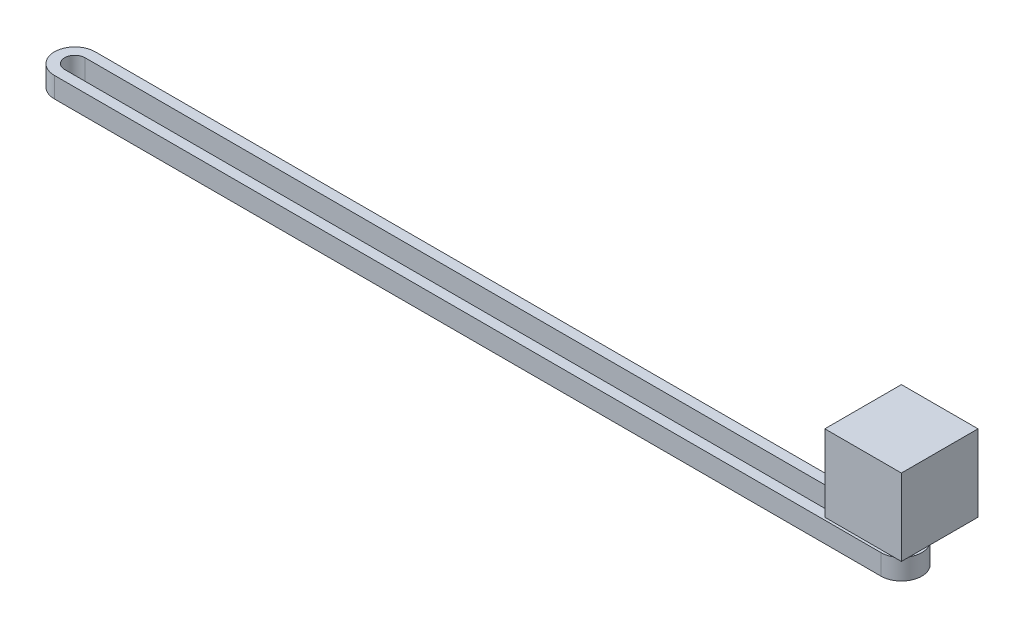
ISO-10303-21;
HEADER;
FILE_DESCRIPTION(('STEP AP214'),'2;1');
FILE_NAME('part.step','',(''),(''),'','','');
FILE_SCHEMA(('AUTOMOTIVE_DESIGN { 1 0 10303 214 1 1 1 1 }'));
ENDSEC;
DATA;
#1=APPLICATION_CONTEXT('core data for automotive mechanical design processes');
#2=APPLICATION_PROTOCOL_DEFINITION('international standard','automotive_design',2000,#1);
#3=PRODUCT_CONTEXT('',#1,'mechanical');
#4=PRODUCT('Part','Part','',(#3));
#5=PRODUCT_RELATED_PRODUCT_CATEGORY('part','',(#4));
#6=PRODUCT_DEFINITION_FORMATION('','',#4);
#7=PRODUCT_DEFINITION_CONTEXT('part definition',#1,'design');
#8=PRODUCT_DEFINITION('design','',#6,#7);
#9=PRODUCT_DEFINITION_SHAPE('','',#8);
#10=(LENGTH_UNIT() NAMED_UNIT(*) SI_UNIT(.MILLI.,.METRE.));
#11=(NAMED_UNIT(*) PLANE_ANGLE_UNIT() SI_UNIT($,.RADIAN.));
#12=(NAMED_UNIT(*) SI_UNIT($,.STERADIAN.) SOLID_ANGLE_UNIT());
#13=UNCERTAINTY_MEASURE_WITH_UNIT(LENGTH_MEASURE(1.E-05),#10,'distance_accuracy_value','');
#14=(GEOMETRIC_REPRESENTATION_CONTEXT(3) GLOBAL_UNCERTAINTY_ASSIGNED_CONTEXT((#13)) GLOBAL_UNIT_ASSIGNED_CONTEXT((#10,
#11,#12)) REPRESENTATION_CONTEXT('',''));
#15=CARTESIAN_POINT('',(0.,0.,0.));
#16=DIRECTION('',(0.,0.,1.));
#17=DIRECTION('',(1.,0.,0.));
#18=AXIS2_PLACEMENT_3D('',#15,#16,#17);
#19=CARTESIAN_POINT('',(0.,-2.,0.));
#20=DIRECTION('',(0.,-1.,0.));
#21=DIRECTION('',(0.,0.,-1.));
#22=AXIS2_PLACEMENT_3D('',#19,#20,#21);
#23=PLANE('',#22);
#24=CARTESIAN_POINT('',(230.,-2.,2.00000000000004));
#25=DIRECTION('',(0.,-1.,0.));
#26=DIRECTION('',(0.,0.,-1.));
#27=AXIS2_PLACEMENT_3D('',#24,#25,#26);
#28=CIRCLE('',#27,2.);
#29=CARTESIAN_POINT('',(230.,-2.,4.00000000000001));
#30=VERTEX_POINT('',#29);
#31=CARTESIAN_POINT('',(230.,-2.,0.));
#32=VERTEX_POINT('',#31);
#33=EDGE_CURVE('E11',#30,#32,#28,.F.);
#34=ORIENTED_EDGE('',*,*,#33,.F.);
#35=DIRECTION('',(-1.,0.,0.));
#36=VECTOR('',#35,1.);
#37=CARTESIAN_POINT('',(232.,-2.,4.00000000000001));
#38=LINE('',#37,#36);
#39=CARTESIAN_POINT('',(228.,-2.,4.00000000000002));
#40=VERTEX_POINT('',#39);
#41=EDGE_CURVE('E249',#30,#40,#38,.T.);
#42=ORIENTED_EDGE('',*,*,#41,.T.);
#43=DIRECTION('',(0.,0.,-1.));
#44=VECTOR('',#43,1.);
#45=CARTESIAN_POINT('',(228.,-2.,4.00000000000002));
#46=LINE('',#45,#44);
#47=CARTESIAN_POINT('',(228.,-2.,0.));
#48=VERTEX_POINT('',#47);
#49=EDGE_CURVE('E246',#40,#48,#46,.T.);
#50=ORIENTED_EDGE('',*,*,#49,.T.);
#51=DIRECTION('',(-1.,0.,0.));
#52=VECTOR('',#51,1.);
#53=CARTESIAN_POINT('',(232.,-2.,0.));
#54=LINE('',#53,#52);
#55=EDGE_CURVE('E243',#32,#48,#54,.T.);
#56=ORIENTED_EDGE('',*,*,#55,.F.);
#57=EDGE_LOOP('',(#34,#42,#50,#56));
#58=FACE_BOUND('',#57,.T.);
#59=ADVANCED_FACE('F37',(#58),#23,.T.);
#60=CARTESIAN_POINT('',(230.,4.,2.00000000000004));
#61=DIRECTION('',(0.,-1.,0.));
#62=DIRECTION('',(0.,0.,-1.));
#63=AXIS2_PLACEMENT_3D('',#60,#61,#62);
#64=CYLINDRICAL_SURFACE('',#63,2.);
#65=CARTESIAN_POINT('',(230.,4.,2.00000000000004));
#66=DIRECTION('',(0.,1.,0.));
#67=DIRECTION('',(0.,0.,1.));
#68=AXIS2_PLACEMENT_3D('',#65,#66,#67);
#69=CIRCLE('',#68,2.);
#70=CARTESIAN_POINT('',(230.,4.,4.00000000000004));
#71=VERTEX_POINT('',#70);
#72=EDGE_CURVE('E176',#71,#71,#69,.F.);
#73=ORIENTED_EDGE('',*,*,#72,.T.);
#74=EDGE_LOOP('',(#73));
#75=FACE_BOUND('',#74,.T.);
#76=CARTESIAN_POINT('',(230.,0.,2.00000000000004));
#77=DIRECTION('',(0.,1.,0.));
#78=DIRECTION('',(0.,0.,1.));
#79=AXIS2_PLACEMENT_3D('',#76,#77,#78);
#80=CIRCLE('',#79,2.);
#81=CARTESIAN_POINT('',(228.,0.,2.00000000000004));
#82=VERTEX_POINT('',#81);
#83=EDGE_CURVE('E45',#82,#82,#80,.F.);
#84=ORIENTED_EDGE('',*,*,#83,.F.);
#85=EDGE_LOOP('',(#84));
#86=FACE_BOUND('',#85,.T.);
#87=ADVANCED_FACE('F39',(#75,#86),#64,.T.);
#88=CARTESIAN_POINT('',(0.,0.,0.));
#89=DIRECTION('',(0.,-1.,0.));
#90=DIRECTION('',(0.,0.,-1.));
#91=AXIS2_PLACEMENT_3D('',#88,#89,#90);
#92=PLANE('',#91);
#93=DIRECTION('',(-1.,0.,0.));
#94=VECTOR('',#93,1.);
#95=CARTESIAN_POINT('',(0.,0.,0.));
#96=LINE('',#95,#94);
#97=CARTESIAN_POINT('',(228.,0.,0.));
#98=VERTEX_POINT('',#97);
#99=CARTESIAN_POINT('',(68.1169302318838,0.,0.));
#100=VERTEX_POINT('',#99);
#101=EDGE_CURVE('E204',#98,#100,#96,.T.);
#102=ORIENTED_EDGE('',*,*,#101,.F.);
#103=DIRECTION('',(0.,0.,-1.));
#104=VECTOR('',#103,1.);
#105=CARTESIAN_POINT('',(228.,0.,4.00000000000002));
#106=LINE('',#105,#104);
#107=EDGE_CURVE('E225',#82,#98,#106,.T.);
#108=ORIENTED_EDGE('',*,*,#107,.F.);
#109=ORIENTED_EDGE('',*,*,#83,.T.);
#110=CARTESIAN_POINT('',(228.,0.,4.00000000000002));
#111=VERTEX_POINT('',#110);
#112=EDGE_CURVE('E247',#111,#82,#106,.T.);
#113=ORIENTED_EDGE('',*,*,#112,.F.);
#114=DIRECTION('',(-1.,0.,0.));
#115=VECTOR('',#114,1.);
#116=CARTESIAN_POINT('',(0.,0.,4.00000000000004));
#117=LINE('',#116,#115);
#118=CARTESIAN_POINT('',(68.1169302318838,0.,4.00000000000004));
#119=VERTEX_POINT('',#118);
#120=EDGE_CURVE('E206',#111,#119,#117,.T.);
#121=ORIENTED_EDGE('',*,*,#120,.T.);
#122=CARTESIAN_POINT('',(68.1169302318838,0.,2.00000000000004));
#123=DIRECTION('',(0.,1.,0.));
#124=DIRECTION('',(0.,0.,1.));
#125=AXIS2_PLACEMENT_3D('',#122,#123,#124);
#126=CIRCLE('',#125,2.);
#127=EDGE_CURVE('E208',#100,#119,#126,.T.);
#128=ORIENTED_EDGE('',*,*,#127,.F.);
#129=EDGE_LOOP('',(#102,#108,#109,#113,#121,#128));
#130=FACE_BOUND('',#129,.T.);
#131=CARTESIAN_POINT('',(230.,0.,2.00000000000004));
#132=DIRECTION('',(0.,1.,0.));
#133=DIRECTION('',(0.,0.,1.));
#134=AXIS2_PLACEMENT_3D('',#131,#132,#133);
#135=CIRCLE('',#134,4.);
#136=CARTESIAN_POINT('',(230.,0.,-1.99999999999996));
#137=VERTEX_POINT('',#136);
#138=CARTESIAN_POINT('',(230.,0.,6.00000000000004));
#139=VERTEX_POINT('',#138);
#140=EDGE_CURVE('E211',#137,#139,#135,.F.);
#141=ORIENTED_EDGE('',*,*,#140,.F.);
#142=DIRECTION('',(-1.,0.,0.));
#143=VECTOR('',#142,1.);
#144=CARTESIAN_POINT('',(0.,0.,-1.99999999999996));
#145=LINE('',#144,#143);
#146=CARTESIAN_POINT('',(68.1169302318838,0.,-1.99999999999996));
#147=VERTEX_POINT('',#146);
#148=EDGE_CURVE('E214',#137,#147,#145,.T.);
#149=ORIENTED_EDGE('',*,*,#148,.T.);
#150=CARTESIAN_POINT('',(68.1169302318838,0.,2.00000000000004));
#151=DIRECTION('',(0.,1.,0.));
#152=DIRECTION('',(0.,0.,1.));
#153=AXIS2_PLACEMENT_3D('',#150,#151,#152);
#154=CIRCLE('',#153,4.);
#155=CARTESIAN_POINT('',(68.1169302318838,0.,6.00000000000004));
#156=VERTEX_POINT('',#155);
#157=EDGE_CURVE('E217',#147,#156,#154,.T.);
#158=ORIENTED_EDGE('',*,*,#157,.T.);
#159=DIRECTION('',(-1.,0.,0.));
#160=VECTOR('',#159,1.);
#161=CARTESIAN_POINT('',(0.,0.,6.00000000000004));
#162=LINE('',#161,#160);
#163=EDGE_CURVE('E184',#139,#156,#162,.T.);
#164=ORIENTED_EDGE('',*,*,#163,.F.);
#165=EDGE_LOOP('',(#141,#149,#158,#164));
#166=FACE_BOUND('',#165,.T.);
#167=ADVANCED_FACE('F263',(#130,#166),#92,.F.);
#168=CARTESIAN_POINT('',(228.,-2.,4.00000000000002));
#169=DIRECTION('',(1.,0.,0.));
#170=DIRECTION('',(0.,0.,-1.));
#171=AXIS2_PLACEMENT_3D('',#168,#169,#170);
#172=PLANE('',#171);
#173=ORIENTED_EDGE('',*,*,#112,.T.);
#174=ORIENTED_EDGE('',*,*,#107,.T.);
#175=DIRECTION('',(0.,1.,0.));
#176=VECTOR('',#175,1.);
#177=CARTESIAN_POINT('',(228.,-2.,0.));
#178=LINE('',#177,#176);
#179=EDGE_CURVE('E251',#48,#98,#178,.T.);
#180=ORIENTED_EDGE('',*,*,#179,.F.);
#181=ORIENTED_EDGE('',*,*,#49,.F.);
#182=DIRECTION('',(0.,1.,0.));
#183=VECTOR('',#182,1.);
#184=CARTESIAN_POINT('',(228.,-2.,4.00000000000002));
#185=LINE('',#184,#183);
#186=EDGE_CURVE('E254',#40,#111,#185,.T.);
#187=ORIENTED_EDGE('',*,*,#186,.T.);
#188=EDGE_LOOP('',(#173,#174,#180,#181,#187));
#189=FACE_BOUND('',#188,.T.);
#190=ADVANCED_FACE('F269',(#189),#172,.F.);
#191=CARTESIAN_POINT('',(0.,-4.,0.));
#192=DIRECTION('',(0.,0.,-1.));
#193=DIRECTION('',(-1.,0.,0.));
#194=AXIS2_PLACEMENT_3D('',#191,#192,#193);
#195=PLANE('',#194);
#196=ORIENTED_EDGE('',*,*,#55,.T.);
#197=ORIENTED_EDGE('',*,*,#179,.T.);
#198=ORIENTED_EDGE('',*,*,#101,.T.);
#199=DIRECTION('',(0.,1.,0.));
#200=VECTOR('',#199,1.);
#201=CARTESIAN_POINT('',(68.1169302318838,-4.,0.));
#202=LINE('',#201,#200);
#203=CARTESIAN_POINT('',(68.1169302318838,-4.,0.));
#204=VERTEX_POINT('',#203);
#205=EDGE_CURVE('E232',#204,#100,#202,.T.);
#206=ORIENTED_EDGE('',*,*,#205,.F.);
#207=DIRECTION('',(-1.,0.,0.));
#208=VECTOR('',#207,1.);
#209=CARTESIAN_POINT('',(0.,-4.,0.));
#210=LINE('',#209,#208);
#211=CARTESIAN_POINT('',(230.,-4.,0.));
#212=VERTEX_POINT('',#211);
#213=EDGE_CURVE('E180',#212,#204,#210,.T.);
#214=ORIENTED_EDGE('',*,*,#213,.F.);
#215=DIRECTION('',(0.,1.,0.));
#216=VECTOR('',#215,1.);
#217=CARTESIAN_POINT('',(230.,-4.,0.));
#218=LINE('',#217,#216);
#219=EDGE_CURVE('E203',#212,#32,#218,.T.);
#220=ORIENTED_EDGE('',*,*,#219,.T.);
#221=EDGE_LOOP('',(#196,#197,#198,#206,#214,#220));
#222=FACE_BOUND('',#221,.T.);
#223=ADVANCED_FACE('F280',(#222),#195,.F.);
#224=CARTESIAN_POINT('',(0.,-4.,4.00000000000004));
#225=DIRECTION('',(0.,0.,-1.));
#226=DIRECTION('',(-1.,0.,0.));
#227=AXIS2_PLACEMENT_3D('',#224,#225,#226);
#228=PLANE('',#227);
#229=ORIENTED_EDGE('',*,*,#186,.F.);
#230=ORIENTED_EDGE('',*,*,#41,.F.);
#231=DIRECTION('',(0.,1.,0.));
#232=VECTOR('',#231,1.);
#233=CARTESIAN_POINT('',(230.,-4.,4.00000000000003));
#234=LINE('',#233,#232);
#235=CARTESIAN_POINT('',(230.,-4.,4.00000000000003));
#236=VERTEX_POINT('',#235);
#237=EDGE_CURVE('E238',#236,#30,#234,.T.);
#238=ORIENTED_EDGE('',*,*,#237,.F.);
#239=DIRECTION('',(-1.,0.,0.));
#240=VECTOR('',#239,1.);
#241=CARTESIAN_POINT('',(0.,-4.,4.00000000000004));
#242=LINE('',#241,#240);
#243=CARTESIAN_POINT('',(68.1169302318838,-4.,4.00000000000004));
#244=VERTEX_POINT('',#243);
#245=EDGE_CURVE('E187',#236,#244,#242,.T.);
#246=ORIENTED_EDGE('',*,*,#245,.T.);
#247=DIRECTION('',(0.,1.,0.));
#248=VECTOR('',#247,1.);
#249=CARTESIAN_POINT('',(68.1169302318838,-4.,4.00000000000004));
#250=LINE('',#249,#248);
#251=EDGE_CURVE('E235',#244,#119,#250,.T.);
#252=ORIENTED_EDGE('',*,*,#251,.T.);
#253=ORIENTED_EDGE('',*,*,#120,.F.);
#254=EDGE_LOOP('',(#229,#230,#238,#246,#252,#253));
#255=FACE_BOUND('',#254,.T.);
#256=ADVANCED_FACE('F273',(#255),#228,.T.);
#257=CARTESIAN_POINT('',(230.,-4.,2.00000000000004));
#258=DIRECTION('',(0.,1.,0.));
#259=DIRECTION('',(0.,0.,1.));
#260=AXIS2_PLACEMENT_3D('',#257,#258,#259);
#261=CYLINDRICAL_SURFACE('',#260,4.);
#262=ORIENTED_EDGE('',*,*,#140,.T.);
#263=DIRECTION('',(0.,1.,0.));
#264=VECTOR('',#263,1.);
#265=CARTESIAN_POINT('',(230.,-4.,6.00000000000004));
#266=LINE('',#265,#264);
#267=CARTESIAN_POINT('',(230.,-4.,6.00000000000004));
#268=VERTEX_POINT('',#267);
#269=EDGE_CURVE('E222',#268,#139,#266,.T.);
#270=ORIENTED_EDGE('',*,*,#269,.F.);
#271=CARTESIAN_POINT('',(230.,-4.,2.00000000000004));
#272=DIRECTION('',(0.,1.,0.));
#273=DIRECTION('',(0.,0.,1.));
#274=AXIS2_PLACEMENT_3D('',#271,#272,#273);
#275=CIRCLE('',#274,4.);
#276=CARTESIAN_POINT('',(230.,-4.,-1.99999999999996));
#277=VERTEX_POINT('',#276);
#278=EDGE_CURVE('E192',#277,#268,#275,.F.);
#279=ORIENTED_EDGE('',*,*,#278,.F.);
#280=DIRECTION('',(0.,1.,0.));
#281=VECTOR('',#280,1.);
#282=CARTESIAN_POINT('',(230.,-4.,-1.99999999999996));
#283=LINE('',#282,#281);
#284=EDGE_CURVE('E230',#277,#137,#283,.T.);
#285=ORIENTED_EDGE('',*,*,#284,.T.);
#286=EDGE_LOOP('',(#262,#270,#279,#285));
#287=FACE_BOUND('',#286,.T.);
#288=ADVANCED_FACE('F297',(#287),#261,.T.);
#289=CARTESIAN_POINT('',(0.,-4.,6.00000000000004));
#290=DIRECTION('',(0.,0.,-1.));
#291=DIRECTION('',(-1.,0.,0.));
#292=AXIS2_PLACEMENT_3D('',#289,#290,#291);
#293=PLANE('',#292);
#294=ORIENTED_EDGE('',*,*,#163,.T.);
#295=DIRECTION('',(0.,1.,0.));
#296=VECTOR('',#295,1.);
#297=CARTESIAN_POINT('',(68.1169302318838,-4.,6.00000000000004));
#298=LINE('',#297,#296);
#299=CARTESIAN_POINT('',(68.1169302318838,-4.,6.00000000000004));
#300=VERTEX_POINT('',#299);
#301=EDGE_CURVE('E226',#300,#156,#298,.T.);
#302=ORIENTED_EDGE('',*,*,#301,.F.);
#303=DIRECTION('',(-1.,0.,0.));
#304=VECTOR('',#303,1.);
#305=CARTESIAN_POINT('',(0.,-4.,6.00000000000004));
#306=LINE('',#305,#304);
#307=EDGE_CURVE('E201',#268,#300,#306,.T.);
#308=ORIENTED_EDGE('',*,*,#307,.F.);
#309=ORIENTED_EDGE('',*,*,#269,.T.);
#310=EDGE_LOOP('',(#294,#302,#308,#309));
#311=FACE_BOUND('',#310,.T.);
#312=ADVANCED_FACE('F300',(#311),#293,.F.);
#313=CARTESIAN_POINT('',(68.1169302318838,-4.,2.00000000000004));
#314=DIRECTION('',(0.,1.,0.));
#315=DIRECTION('',(0.,0.,1.));
#316=AXIS2_PLACEMENT_3D('',#313,#314,#315);
#317=CYLINDRICAL_SURFACE('',#316,4.);
#318=ORIENTED_EDGE('',*,*,#157,.F.);
#319=DIRECTION('',(0.,1.,0.));
#320=VECTOR('',#319,1.);
#321=CARTESIAN_POINT('',(68.1169302318838,-4.,-1.99999999999996));
#322=LINE('',#321,#320);
#323=CARTESIAN_POINT('',(68.1169302318838,-4.,-1.99999999999996));
#324=VERTEX_POINT('',#323);
#325=EDGE_CURVE('E228',#324,#147,#322,.T.);
#326=ORIENTED_EDGE('',*,*,#325,.F.);
#327=CARTESIAN_POINT('',(68.1169302318838,-4.,2.00000000000004));
#328=DIRECTION('',(0.,1.,0.));
#329=DIRECTION('',(0.,0.,1.));
#330=AXIS2_PLACEMENT_3D('',#327,#328,#329);
#331=CIRCLE('',#330,4.);
#332=EDGE_CURVE('E198',#324,#300,#331,.T.);
#333=ORIENTED_EDGE('',*,*,#332,.T.);
#334=ORIENTED_EDGE('',*,*,#301,.T.);
#335=EDGE_LOOP('',(#318,#326,#333,#334));
#336=FACE_BOUND('',#335,.T.);
#337=ADVANCED_FACE('F303',(#336),#317,.T.);
#338=CARTESIAN_POINT('',(68.1169302318838,-4.,2.00000000000004));
#339=DIRECTION('',(0.,1.,0.));
#340=DIRECTION('',(0.,0.,1.));
#341=AXIS2_PLACEMENT_3D('',#338,#339,#340);
#342=CYLINDRICAL_SURFACE('',#341,2.);
#343=ORIENTED_EDGE('',*,*,#127,.T.);
#344=ORIENTED_EDGE('',*,*,#251,.F.);
#345=CARTESIAN_POINT('',(68.1169302318838,-4.,2.00000000000004));
#346=DIRECTION('',(0.,1.,0.));
#347=DIRECTION('',(0.,0.,1.));
#348=AXIS2_PLACEMENT_3D('',#345,#346,#347);
#349=CIRCLE('',#348,2.);
#350=EDGE_CURVE('E190',#204,#244,#349,.T.);
#351=ORIENTED_EDGE('',*,*,#350,.F.);
#352=ORIENTED_EDGE('',*,*,#205,.T.);
#353=EDGE_LOOP('',(#343,#344,#351,#352));
#354=FACE_BOUND('',#353,.T.);
#355=ADVANCED_FACE('F277',(#354),#342,.F.);
#356=CARTESIAN_POINT('',(230.,-4.,2.00000000000004));
#357=DIRECTION('',(0.,1.,0.));
#358=DIRECTION('',(0.,0.,1.));
#359=AXIS2_PLACEMENT_3D('',#356,#357,#358);
#360=CYLINDRICAL_SURFACE('',#359,2.);
#361=ORIENTED_EDGE('',*,*,#237,.T.);
#362=ORIENTED_EDGE('',*,*,#33,.T.);
#363=ORIENTED_EDGE('',*,*,#219,.F.);
#364=CARTESIAN_POINT('',(230.,-4.,2.00000000000004));
#365=DIRECTION('',(0.,1.,0.));
#366=DIRECTION('',(0.,0.,1.));
#367=AXIS2_PLACEMENT_3D('',#364,#365,#366);
#368=CIRCLE('',#367,2.);
#369=EDGE_CURVE('E183',#212,#236,#368,.F.);
#370=ORIENTED_EDGE('',*,*,#369,.T.);
#371=EDGE_LOOP('',(#361,#362,#363,#370));
#372=FACE_BOUND('',#371,.T.);
#373=ADVANCED_FACE('F283',(#372),#360,.F.);
#374=CARTESIAN_POINT('',(0.,-4.,-1.99999999999996));
#375=DIRECTION('',(0.,0.,-1.));
#376=DIRECTION('',(-1.,0.,0.));
#377=AXIS2_PLACEMENT_3D('',#374,#375,#376);
#378=PLANE('',#377);
#379=ORIENTED_EDGE('',*,*,#148,.F.);
#380=ORIENTED_EDGE('',*,*,#284,.F.);
#381=DIRECTION('',(-1.,0.,0.));
#382=VECTOR('',#381,1.);
#383=CARTESIAN_POINT('',(0.,-4.,-1.99999999999996));
#384=LINE('',#383,#382);
#385=EDGE_CURVE('E195',#277,#324,#384,.T.);
#386=ORIENTED_EDGE('',*,*,#385,.T.);
#387=ORIENTED_EDGE('',*,*,#325,.T.);
#388=EDGE_LOOP('',(#379,#380,#386,#387));
#389=FACE_BOUND('',#388,.T.);
#390=ADVANCED_FACE('F289',(#389),#378,.T.);
#391=CARTESIAN_POINT('',(0.,-4.,0.));
#392=DIRECTION('',(0.,1.,0.));
#393=DIRECTION('',(0.,0.,1.));
#394=AXIS2_PLACEMENT_3D('',#391,#392,#393);
#395=PLANE('',#394);
#396=ORIENTED_EDGE('',*,*,#213,.T.);
#397=ORIENTED_EDGE('',*,*,#350,.T.);
#398=ORIENTED_EDGE('',*,*,#245,.F.);
#399=ORIENTED_EDGE('',*,*,#369,.F.);
#400=EDGE_LOOP('',(#396,#397,#398,#399));
#401=FACE_BOUND('',#400,.T.);
#402=ORIENTED_EDGE('',*,*,#278,.T.);
#403=ORIENTED_EDGE('',*,*,#307,.T.);
#404=ORIENTED_EDGE('',*,*,#332,.F.);
#405=ORIENTED_EDGE('',*,*,#385,.F.);
#406=EDGE_LOOP('',(#402,#403,#404,#405));
#407=FACE_BOUND('',#406,.T.);
#408=ADVANCED_FACE('F286',(#401,#407),#395,.F.);
#409=CARTESIAN_POINT('',(0.,19.,9.50000000000005));
#410=DIRECTION('',(0.,0.,1.));
#411=DIRECTION('',(1.,0.,0.));
#412=AXIS2_PLACEMENT_3D('',#409,#410,#411);
#413=PLANE('',#412);
#414=DIRECTION('',(-1.,0.,0.));
#415=VECTOR('',#414,1.);
#416=CARTESIAN_POINT('',(0.,4.,9.50000000000005));
#417=LINE('',#416,#415);
#418=CARTESIAN_POINT('',(237.5,4.,9.50000000000005));
#419=VERTEX_POINT('',#418);
#420=CARTESIAN_POINT('',(222.5,4.,9.50000000000005));
#421=VERTEX_POINT('',#420);
#422=EDGE_CURVE('E171',#419,#421,#417,.T.);
#423=ORIENTED_EDGE('',*,*,#422,.F.);
#424=DIRECTION('',(0.,-1.,0.));
#425=VECTOR('',#424,1.);
#426=CARTESIAN_POINT('',(237.5,19.,9.50000000000005));
#427=LINE('',#426,#425);
#428=CARTESIAN_POINT('',(237.5,19.,9.50000000000005));
#429=VERTEX_POINT('',#428);
#430=EDGE_CURVE('E162',#429,#419,#427,.T.);
#431=ORIENTED_EDGE('',*,*,#430,.F.);
#432=DIRECTION('',(-1.,0.,0.));
#433=VECTOR('',#432,1.);
#434=CARTESIAN_POINT('',(0.,19.,9.50000000000005));
#435=LINE('',#434,#433);
#436=CARTESIAN_POINT('',(222.5,19.,9.50000000000005));
#437=VERTEX_POINT('',#436);
#438=EDGE_CURVE('E142',#429,#437,#435,.T.);
#439=ORIENTED_EDGE('',*,*,#438,.T.);
#440=DIRECTION('',(0.,-1.,0.));
#441=VECTOR('',#440,1.);
#442=CARTESIAN_POINT('',(222.5,19.,9.50000000000005));
#443=LINE('',#442,#441);
#444=EDGE_CURVE('E151',#437,#421,#443,.T.);
#445=ORIENTED_EDGE('',*,*,#444,.T.);
#446=EDGE_LOOP('',(#423,#431,#439,#445));
#447=FACE_BOUND('',#446,.T.);
#448=ADVANCED_FACE('F161',(#447),#413,.T.);
#449=CARTESIAN_POINT('',(237.5,19.,0.));
#450=DIRECTION('',(1.,0.,0.));
#451=DIRECTION('',(0.,0.,-1.));
#452=AXIS2_PLACEMENT_3D('',#449,#450,#451);
#453=PLANE('',#452);
#454=DIRECTION('',(0.,0.,1.));
#455=VECTOR('',#454,1.);
#456=CARTESIAN_POINT('',(237.5,4.,0.));
#457=LINE('',#456,#455);
#458=CARTESIAN_POINT('',(237.5,4.,-5.49999999999997));
#459=VERTEX_POINT('',#458);
#460=EDGE_CURVE('E163',#459,#419,#457,.T.);
#461=ORIENTED_EDGE('',*,*,#460,.F.);
#462=DIRECTION('',(0.,-1.,0.));
#463=VECTOR('',#462,1.);
#464=CARTESIAN_POINT('',(237.5,19.,-5.49999999999997));
#465=LINE('',#464,#463);
#466=CARTESIAN_POINT('',(237.5,19.,-5.49999999999997));
#467=VERTEX_POINT('',#466);
#468=EDGE_CURVE('E177',#467,#459,#465,.T.);
#469=ORIENTED_EDGE('',*,*,#468,.F.);
#470=DIRECTION('',(0.,0.,1.));
#471=VECTOR('',#470,1.);
#472=CARTESIAN_POINT('',(237.5,19.,0.));
#473=LINE('',#472,#471);
#474=EDGE_CURVE('E159',#467,#429,#473,.T.);
#475=ORIENTED_EDGE('',*,*,#474,.T.);
#476=ORIENTED_EDGE('',*,*,#430,.T.);
#477=EDGE_LOOP('',(#461,#469,#475,#476));
#478=FACE_BOUND('',#477,.T.);
#479=ADVANCED_FACE('F336',(#478),#453,.T.);
#480=CARTESIAN_POINT('',(0.,19.,-5.49999999999997));
#481=DIRECTION('',(0.,0.,1.));
#482=DIRECTION('',(1.,0.,0.));
#483=AXIS2_PLACEMENT_3D('',#480,#481,#482);
#484=PLANE('',#483);
#485=DIRECTION('',(-1.,0.,0.));
#486=VECTOR('',#485,1.);
#487=CARTESIAN_POINT('',(0.,4.,-5.49999999999997));
#488=LINE('',#487,#486);
#489=CARTESIAN_POINT('',(222.5,4.,-5.49999999999997));
#490=VERTEX_POINT('',#489);
#491=EDGE_CURVE('E166',#459,#490,#488,.T.);
#492=ORIENTED_EDGE('',*,*,#491,.T.);
#493=DIRECTION('',(0.,-1.,0.));
#494=VECTOR('',#493,1.);
#495=CARTESIAN_POINT('',(222.5,19.,-5.49999999999997));
#496=LINE('',#495,#494);
#497=CARTESIAN_POINT('',(222.5,19.,-5.49999999999997));
#498=VERTEX_POINT('',#497);
#499=EDGE_CURVE('E158',#498,#490,#496,.T.);
#500=ORIENTED_EDGE('',*,*,#499,.F.);
#501=DIRECTION('',(-1.,0.,0.));
#502=VECTOR('',#501,1.);
#503=CARTESIAN_POINT('',(0.,19.,-5.49999999999997));
#504=LINE('',#503,#502);
#505=EDGE_CURVE('E145',#467,#498,#504,.T.);
#506=ORIENTED_EDGE('',*,*,#505,.F.);
#507=ORIENTED_EDGE('',*,*,#468,.T.);
#508=EDGE_LOOP('',(#492,#500,#506,#507));
#509=FACE_BOUND('',#508,.T.);
#510=ADVANCED_FACE('F339',(#509),#484,.F.);
#511=CARTESIAN_POINT('',(222.5,19.,0.));
#512=DIRECTION('',(1.,0.,0.));
#513=DIRECTION('',(0.,0.,-1.));
#514=AXIS2_PLACEMENT_3D('',#511,#512,#513);
#515=PLANE('',#514);
#516=DIRECTION('',(0.,0.,1.));
#517=VECTOR('',#516,1.);
#518=CARTESIAN_POINT('',(222.5,4.,0.));
#519=LINE('',#518,#517);
#520=EDGE_CURVE('E154',#490,#421,#519,.T.);
#521=ORIENTED_EDGE('',*,*,#520,.T.);
#522=ORIENTED_EDGE('',*,*,#444,.F.);
#523=DIRECTION('',(0.,0.,1.));
#524=VECTOR('',#523,1.);
#525=CARTESIAN_POINT('',(222.5,19.,0.));
#526=LINE('',#525,#524);
#527=EDGE_CURVE('E137',#498,#437,#526,.T.);
#528=ORIENTED_EDGE('',*,*,#527,.F.);
#529=ORIENTED_EDGE('',*,*,#499,.T.);
#530=EDGE_LOOP('',(#521,#522,#528,#529));
#531=FACE_BOUND('',#530,.T.);
#532=ADVANCED_FACE('F152',(#531),#515,.F.);
#533=CARTESIAN_POINT('',(0.,19.,0.));
#534=DIRECTION('',(0.,1.,0.));
#535=DIRECTION('',(0.,0.,1.));
#536=AXIS2_PLACEMENT_3D('',#533,#534,#535);
#537=PLANE('',#536);
#538=ORIENTED_EDGE('',*,*,#438,.F.);
#539=ORIENTED_EDGE('',*,*,#474,.F.);
#540=ORIENTED_EDGE('',*,*,#505,.T.);
#541=ORIENTED_EDGE('',*,*,#527,.T.);
#542=EDGE_LOOP('',(#538,#539,#540,#541));
#543=FACE_BOUND('',#542,.T.);
#544=ADVANCED_FACE('F139',(#543),#537,.T.);
#545=CARTESIAN_POINT('',(0.,4.,0.));
#546=DIRECTION('',(0.,1.,0.));
#547=DIRECTION('',(0.,0.,1.));
#548=AXIS2_PLACEMENT_3D('',#545,#546,#547);
#549=PLANE('',#548);
#550=ORIENTED_EDGE('',*,*,#72,.F.);
#551=EDGE_LOOP('',(#550));
#552=FACE_BOUND('',#551,.T.);
#553=ORIENTED_EDGE('',*,*,#422,.T.);
#554=ORIENTED_EDGE('',*,*,#520,.F.);
#555=ORIENTED_EDGE('',*,*,#491,.F.);
#556=ORIENTED_EDGE('',*,*,#460,.T.);
#557=EDGE_LOOP('',(#553,#554,#555,#556));
#558=FACE_BOUND('',#557,.T.);
#559=ADVANCED_FACE('F346',(#552,#558),#549,.F.);
#560=CLOSED_SHELL('',(#59,#87,#167,#190,#223,#256,#288,#312,#337,#355,#373,#390,#408,#448,#479,
#510,#532,#544,#559));
#561=MANIFOLD_SOLID_BREP('B2',#560);
#562=ADVANCED_BREP_SHAPE_REPRESENTATION('',(#18,#561),#14);
#563=SHAPE_DEFINITION_REPRESENTATION(#9,#562);
ENDSEC;
END-ISO-10303-21;
